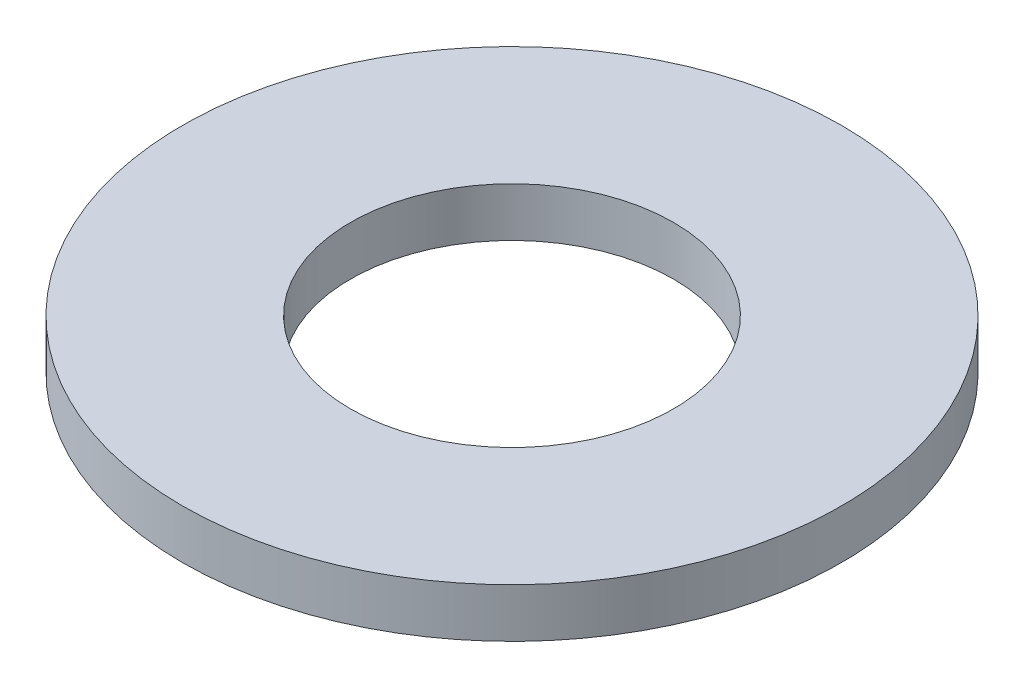
ISO-10303-21;
HEADER;
FILE_DESCRIPTION(('STEP AP214'),'2;1');
FILE_NAME('part.step','',(''),(''),'','','');
FILE_SCHEMA(('AUTOMOTIVE_DESIGN { 1 0 10303 214 1 1 1 1 }'));
ENDSEC;
DATA;
#1=APPLICATION_CONTEXT('core data for automotive mechanical design processes');
#2=APPLICATION_PROTOCOL_DEFINITION('international standard','automotive_design',2000,#1);
#3=PRODUCT_CONTEXT('',#1,'mechanical');
#4=PRODUCT('Part','Part','',(#3));
#5=PRODUCT_RELATED_PRODUCT_CATEGORY('part','',(#4));
#6=PRODUCT_DEFINITION_FORMATION('','',#4);
#7=PRODUCT_DEFINITION_CONTEXT('part definition',#1,'design');
#8=PRODUCT_DEFINITION('design','',#6,#7);
#9=PRODUCT_DEFINITION_SHAPE('','',#8);
#10=(LENGTH_UNIT() NAMED_UNIT(*) SI_UNIT(.MILLI.,.METRE.));
#11=(NAMED_UNIT(*) PLANE_ANGLE_UNIT() SI_UNIT($,.RADIAN.));
#12=(NAMED_UNIT(*) SI_UNIT($,.STERADIAN.) SOLID_ANGLE_UNIT());
#13=UNCERTAINTY_MEASURE_WITH_UNIT(LENGTH_MEASURE(1.E-05),#10,'distance_accuracy_value','');
#14=(GEOMETRIC_REPRESENTATION_CONTEXT(3) GLOBAL_UNCERTAINTY_ASSIGNED_CONTEXT((#13)) GLOBAL_UNIT_ASSIGNED_CONTEXT((#10,
#11,#12)) REPRESENTATION_CONTEXT('',''));
#15=CARTESIAN_POINT('',(0.,0.,0.));
#16=DIRECTION('',(0.,0.,1.));
#17=DIRECTION('',(1.,0.,0.));
#18=AXIS2_PLACEMENT_3D('',#15,#16,#17);
#19=CARTESIAN_POINT('',(0.,0.4826,0.));
#20=DIRECTION('',(0.,-1.,0.));
#21=DIRECTION('',(0.,0.,-1.));
#22=AXIS2_PLACEMENT_3D('',#19,#20,#21);
#23=CYLINDRICAL_SURFACE('',#22,3.2385);
#24=CARTESIAN_POINT('',(0.,0.4826,0.));
#25=DIRECTION('',(0.,1.,0.));
#26=DIRECTION('',(0.,0.,1.));
#27=AXIS2_PLACEMENT_3D('',#24,#25,#26);
#28=CIRCLE('',#27,3.2385);
#29=CARTESIAN_POINT('',(0.,0.4826,-3.2385));
#30=VERTEX_POINT('',#29);
#31=EDGE_CURVE('E10',#30,#30,#28,.T.);
#32=CARTESIAN_POINT('',(0.,0.,0.));
#33=DIRECTION('',(0.,1.,0.));
#34=DIRECTION('',(0.,0.,1.));
#35=AXIS2_PLACEMENT_3D('',#32,#33,#34);
#36=CIRCLE('',#35,3.2385);
#37=CARTESIAN_POINT('',(0.,0.,-3.2385));
#38=VERTEX_POINT('',#37);
#39=EDGE_CURVE('E31',#38,#38,#36,.T.);
#40=CARTESIAN_POINT('',(0.,0.4826,-3.2385));
#41=CARTESIAN_POINT('',(0.,0.477572916666667,-3.2385));
#42=CARTESIAN_POINT('',(0.,0.472545833333333,-3.2385));
#43=CARTESIAN_POINT('',(0.,0.462491666666667,-3.2385));
#44=CARTESIAN_POINT('',(0.,0.457464583333333,-3.2385));
#45=CARTESIAN_POINT('',(0.,0.447410416666667,-3.2385));
#46=CARTESIAN_POINT('',(0.,0.442383333333333,-3.2385));
#47=CARTESIAN_POINT('',(0.,0.432329166666667,-3.2385));
#48=CARTESIAN_POINT('',(0.,0.427302083333333,-3.2385));
#49=CARTESIAN_POINT('',(0.,0.417247916666667,-3.2385));
#50=CARTESIAN_POINT('',(0.,0.412220833333333,-3.2385));
#51=CARTESIAN_POINT('',(0.,0.402166666666667,-3.2385));
#52=CARTESIAN_POINT('',(0.,0.397139583333333,-3.2385));
#53=CARTESIAN_POINT('',(0.,0.387085416666667,-3.2385));
#54=CARTESIAN_POINT('',(0.,0.382058333333333,-3.2385));
#55=CARTESIAN_POINT('',(0.,0.372004166666667,-3.2385));
#56=CARTESIAN_POINT('',(0.,0.366977083333333,-3.2385));
#57=CARTESIAN_POINT('',(0.,0.356922916666667,-3.2385));
#58=CARTESIAN_POINT('',(0.,0.351895833333333,-3.2385));
#59=CARTESIAN_POINT('',(0.,0.341841666666667,-3.2385));
#60=CARTESIAN_POINT('',(0.,0.336814583333333,-3.2385));
#61=CARTESIAN_POINT('',(0.,0.326760416666667,-3.2385));
#62=CARTESIAN_POINT('',(0.,0.321733333333333,-3.2385));
#63=CARTESIAN_POINT('',(0.,0.311679166666667,-3.2385));
#64=CARTESIAN_POINT('',(0.,0.306652083333333,-3.2385));
#65=CARTESIAN_POINT('',(0.,0.296597916666667,-3.2385));
#66=CARTESIAN_POINT('',(0.,0.291570833333333,-3.2385));
#67=CARTESIAN_POINT('',(0.,0.281516666666667,-3.2385));
#68=CARTESIAN_POINT('',(0.,0.276489583333333,-3.2385));
#69=CARTESIAN_POINT('',(0.,0.266435416666667,-3.2385));
#70=CARTESIAN_POINT('',(0.,0.261408333333333,-3.2385));
#71=CARTESIAN_POINT('',(0.,0.251354166666667,-3.2385));
#72=CARTESIAN_POINT('',(0.,0.246327083333333,-3.2385));
#73=CARTESIAN_POINT('',(0.,0.236272916666667,-3.2385));
#74=CARTESIAN_POINT('',(0.,0.231245833333333,-3.2385));
#75=CARTESIAN_POINT('',(0.,0.221191666666667,-3.2385));
#76=CARTESIAN_POINT('',(0.,0.216164583333333,-3.2385));
#77=CARTESIAN_POINT('',(0.,0.206110416666667,-3.2385));
#78=CARTESIAN_POINT('',(0.,0.201083333333333,-3.2385));
#79=CARTESIAN_POINT('',(0.,0.191029166666667,-3.2385));
#80=CARTESIAN_POINT('',(0.,0.186002083333333,-3.2385));
#81=CARTESIAN_POINT('',(0.,0.175947916666667,-3.2385));
#82=CARTESIAN_POINT('',(0.,0.170920833333333,-3.2385));
#83=CARTESIAN_POINT('',(0.,0.160866666666667,-3.2385));
#84=CARTESIAN_POINT('',(0.,0.155839583333333,-3.2385));
#85=CARTESIAN_POINT('',(0.,0.145785416666667,-3.2385));
#86=CARTESIAN_POINT('',(0.,0.140758333333333,-3.2385));
#87=CARTESIAN_POINT('',(0.,0.130704166666667,-3.2385));
#88=CARTESIAN_POINT('',(0.,0.125677083333333,-3.2385));
#89=CARTESIAN_POINT('',(0.,0.115622916666667,-3.2385));
#90=CARTESIAN_POINT('',(0.,0.110595833333333,-3.2385));
#91=CARTESIAN_POINT('',(0.,0.100541666666667,-3.2385));
#92=CARTESIAN_POINT('',(0.,0.0955145833333333,-3.2385));
#93=CARTESIAN_POINT('',(0.,0.0854604166666667,-3.2385));
#94=CARTESIAN_POINT('',(0.,0.0804333333333333,-3.2385));
#95=CARTESIAN_POINT('',(0.,0.0703791666666667,-3.2385));
#96=CARTESIAN_POINT('',(0.,0.0653520833333334,-3.2385));
#97=CARTESIAN_POINT('',(0.,0.0552979166666667,-3.2385));
#98=CARTESIAN_POINT('',(0.,0.0502708333333333,-3.2385));
#99=CARTESIAN_POINT('',(0.,0.0402166666666666,-3.2385));
#100=CARTESIAN_POINT('',(0.,0.0351895833333333,-3.2385));
#101=CARTESIAN_POINT('',(0.,0.0251354166666666,-3.2385));
#102=CARTESIAN_POINT('',(0.,0.0201083333333333,-3.2385));
#103=CARTESIAN_POINT('',(0.,0.0100541666666667,-3.2385));
#104=CARTESIAN_POINT('',(0.,0.00502708333333333,-3.2385));
#105=CARTESIAN_POINT('',(0.,0.,-3.2385));
#106=B_SPLINE_CURVE_WITH_KNOTS('',3,(#40,#41,#42,#43,#44,#45,#46,#47,#48,#49,#50,#51,#52,#53,
#54,#55,#56,#57,#58,#59,#60,#61,#62,#63,#64,#65,#66,#67,#68,#69,#70,#71,#72,#73,#74,#75,#76,#77,
#78,#79,#80,#81,#82,#83,#84,#85,#86,#87,#88,#89,#90,#91,#92,#93,#94,#95,#96,#97,#98,#99,#100,
#101,#102,#103,#104,#105),.UNSPECIFIED.,.F.,.F.,(4,2,2,2,2,2,2,2,2,2,2,2,2,2,2,2,2,2,2,2,2,2,2,
2,2,2,2,2,2,2,2,2,4),(0.,0.01508125,0.0301625,0.04524375,0.060325,0.07540625,0.0904874999999999,
0.10556875,0.12065,0.13573125,0.1508125,0.16589375,0.180975,0.19605625,0.2111375,0.22621875,
0.2413,0.25638125,0.2714625,0.28654375,0.301625,0.31670625,0.3317875,0.34686875,0.36195,
0.37703125,0.3921125,0.40719375,0.422275,0.43735625,0.4524375,0.46751875,0.4826),.UNSPECIFIED.);
#107=EDGE_CURVE('BSEAM28',#30,#38,#106,.T.);
#108=ORIENTED_EDGE('',*,*,#31,.F.);
#109=ORIENTED_EDGE('',*,*,#39,.T.);
#110=ORIENTED_EDGE('',*,*,#107,.T.);
#111=ORIENTED_EDGE('',*,*,#107,.F.);
#112=EDGE_LOOP('',(#108,#110,#109,#111));
#113=FACE_BOUND('',#112,.T.);
#114=ADVANCED_FACE('F28',(#113),#23,.T.);
#115=CARTESIAN_POINT('',(0.,0.4826,0.));
#116=DIRECTION('',(0.,1.,0.));
#117=DIRECTION('',(0.,0.,1.));
#118=AXIS2_PLACEMENT_3D('',#115,#116,#117);
#119=PLANE('',#118);
#120=CARTESIAN_POINT('',(0.,0.4826,0.));
#121=DIRECTION('',(0.,1.,0.));
#122=DIRECTION('',(0.,0.,1.));
#123=AXIS2_PLACEMENT_3D('',#120,#121,#122);
#124=CIRCLE('',#123,1.5875);
#125=CARTESIAN_POINT('',(0.,0.4826,1.5875));
#126=VERTEX_POINT('',#125);
#127=EDGE_CURVE('E40',#126,#126,#124,.T.);
#128=ORIENTED_EDGE('',*,*,#127,.F.);
#129=EDGE_LOOP('',(#128));
#130=FACE_BOUND('',#129,.T.);
#131=ORIENTED_EDGE('',*,*,#31,.T.);
#132=EDGE_LOOP('',(#131));
#133=FACE_BOUND('',#132,.T.);
#134=ADVANCED_FACE('F55',(#130,#133),#119,.T.);
#135=CARTESIAN_POINT('',(0.,0.,0.));
#136=DIRECTION('',(0.,1.,0.));
#137=DIRECTION('',(0.,0.,1.));
#138=AXIS2_PLACEMENT_3D('',#135,#136,#137);
#139=PLANE('',#138);
#140=CARTESIAN_POINT('',(0.,0.,0.));
#141=DIRECTION('',(0.,1.,0.));
#142=DIRECTION('',(0.,0.,1.));
#143=AXIS2_PLACEMENT_3D('',#140,#141,#142);
#144=CIRCLE('',#143,1.5875);
#145=CARTESIAN_POINT('',(0.,0.,1.5875));
#146=VERTEX_POINT('',#145);
#147=EDGE_CURVE('E38',#146,#146,#144,.T.);
#148=ORIENTED_EDGE('',*,*,#147,.T.);
#149=EDGE_LOOP('',(#148));
#150=FACE_BOUND('',#149,.T.);
#151=ORIENTED_EDGE('',*,*,#39,.F.);
#152=EDGE_LOOP('',(#151));
#153=FACE_BOUND('',#152,.T.);
#154=ADVANCED_FACE('F46',(#150,#153),#139,.F.);
#155=CARTESIAN_POINT('',(0.,0.,0.));
#156=DIRECTION('',(0.,1.,0.));
#157=DIRECTION('',(0.,0.,1.));
#158=AXIS2_PLACEMENT_3D('',#155,#156,#157);
#159=CYLINDRICAL_SURFACE('',#158,1.5875);
#160=CARTESIAN_POINT('',(0.,0.,1.5875));
#161=CARTESIAN_POINT('',(0.,0.00502708333333333,1.5875));
#162=CARTESIAN_POINT('',(0.,0.0100541666666667,1.5875));
#163=CARTESIAN_POINT('',(0.,0.0201083333333333,1.5875));
#164=CARTESIAN_POINT('',(0.,0.0251354166666667,1.5875));
#165=CARTESIAN_POINT('',(0.,0.0351895833333333,1.5875));
#166=CARTESIAN_POINT('',(0.,0.0402166666666667,1.5875));
#167=CARTESIAN_POINT('',(0.,0.0502708333333333,1.5875));
#168=CARTESIAN_POINT('',(0.,0.0552979166666667,1.5875));
#169=CARTESIAN_POINT('',(0.,0.0653520833333333,1.5875));
#170=CARTESIAN_POINT('',(0.,0.0703791666666667,1.5875));
#171=CARTESIAN_POINT('',(0.,0.0804333333333333,1.5875));
#172=CARTESIAN_POINT('',(0.,0.0854604166666666,1.5875));
#173=CARTESIAN_POINT('',(0.,0.0955145833333333,1.5875));
#174=CARTESIAN_POINT('',(0.,0.100541666666667,1.5875));
#175=CARTESIAN_POINT('',(0.,0.110595833333333,1.5875));
#176=CARTESIAN_POINT('',(0.,0.115622916666667,1.5875));
#177=CARTESIAN_POINT('',(0.,0.125677083333333,1.5875));
#178=CARTESIAN_POINT('',(0.,0.130704166666667,1.5875));
#179=CARTESIAN_POINT('',(0.,0.140758333333333,1.5875));
#180=CARTESIAN_POINT('',(0.,0.145785416666667,1.5875));
#181=CARTESIAN_POINT('',(0.,0.155839583333333,1.5875));
#182=CARTESIAN_POINT('',(0.,0.160866666666667,1.5875));
#183=CARTESIAN_POINT('',(0.,0.170920833333333,1.5875));
#184=CARTESIAN_POINT('',(0.,0.175947916666667,1.5875));
#185=CARTESIAN_POINT('',(0.,0.186002083333333,1.5875));
#186=CARTESIAN_POINT('',(0.,0.191029166666667,1.5875));
#187=CARTESIAN_POINT('',(0.,0.201083333333333,1.5875));
#188=CARTESIAN_POINT('',(0.,0.206110416666667,1.5875));
#189=CARTESIAN_POINT('',(0.,0.216164583333333,1.5875));
#190=CARTESIAN_POINT('',(0.,0.221191666666667,1.5875));
#191=CARTESIAN_POINT('',(0.,0.231245833333333,1.5875));
#192=CARTESIAN_POINT('',(0.,0.236272916666667,1.5875));
#193=CARTESIAN_POINT('',(0.,0.246327083333333,1.5875));
#194=CARTESIAN_POINT('',(0.,0.251354166666667,1.5875));
#195=CARTESIAN_POINT('',(0.,0.261408333333333,1.5875));
#196=CARTESIAN_POINT('',(0.,0.266435416666667,1.5875));
#197=CARTESIAN_POINT('',(0.,0.276489583333333,1.5875));
#198=CARTESIAN_POINT('',(0.,0.281516666666667,1.5875));
#199=CARTESIAN_POINT('',(0.,0.291570833333333,1.5875));
#200=CARTESIAN_POINT('',(0.,0.296597916666667,1.5875));
#201=CARTESIAN_POINT('',(0.,0.306652083333333,1.5875));
#202=CARTESIAN_POINT('',(0.,0.311679166666667,1.5875));
#203=CARTESIAN_POINT('',(0.,0.321733333333333,1.5875));
#204=CARTESIAN_POINT('',(0.,0.326760416666667,1.5875));
#205=CARTESIAN_POINT('',(0.,0.336814583333333,1.5875));
#206=CARTESIAN_POINT('',(0.,0.341841666666667,1.5875));
#207=CARTESIAN_POINT('',(0.,0.351895833333333,1.5875));
#208=CARTESIAN_POINT('',(0.,0.356922916666667,1.5875));
#209=CARTESIAN_POINT('',(0.,0.366977083333333,1.5875));
#210=CARTESIAN_POINT('',(0.,0.372004166666667,1.5875));
#211=CARTESIAN_POINT('',(0.,0.382058333333333,1.5875));
#212=CARTESIAN_POINT('',(0.,0.387085416666667,1.5875));
#213=CARTESIAN_POINT('',(0.,0.397139583333333,1.5875));
#214=CARTESIAN_POINT('',(0.,0.402166666666667,1.5875));
#215=CARTESIAN_POINT('',(0.,0.412220833333333,1.5875));
#216=CARTESIAN_POINT('',(0.,0.417247916666667,1.5875));
#217=CARTESIAN_POINT('',(0.,0.427302083333333,1.5875));
#218=CARTESIAN_POINT('',(0.,0.432329166666667,1.5875));
#219=CARTESIAN_POINT('',(0.,0.442383333333333,1.5875));
#220=CARTESIAN_POINT('',(0.,0.447410416666667,1.5875));
#221=CARTESIAN_POINT('',(0.,0.457464583333333,1.5875));
#222=CARTESIAN_POINT('',(0.,0.462491666666667,1.5875));
#223=CARTESIAN_POINT('',(0.,0.472545833333333,1.5875));
#224=CARTESIAN_POINT('',(0.,0.477572916666667,1.5875));
#225=CARTESIAN_POINT('',(0.,0.4826,1.5875));
#226=B_SPLINE_CURVE_WITH_KNOTS('',3,(#160,#161,#162,#163,#164,#165,#166,#167,#168,#169,#170,
#171,#172,#173,#174,#175,#176,#177,#178,#179,#180,#181,#182,#183,#184,#185,#186,#187,#188,#189,
#190,#191,#192,#193,#194,#195,#196,#197,#198,#199,#200,#201,#202,#203,#204,#205,#206,#207,#208,
#209,#210,#211,#212,#213,#214,#215,#216,#217,#218,#219,#220,#221,#222,#223,#224,#225),
.UNSPECIFIED.,.F.,.F.,(4,2,2,2,2,2,2,2,2,2,2,2,2,2,2,2,2,2,2,2,2,2,2,2,2,2,2,2,2,2,2,2,4),(0.,
0.01508125,0.0301625,0.04524375,0.060325,0.07540625,0.0904875,0.10556875,0.12065,0.13573125,
0.1508125,0.16589375,0.180975,0.19605625,0.2111375,0.22621875,0.2413,0.25638125,0.2714625,
0.28654375,0.301625,0.31670625,0.3317875,0.34686875,0.36195,0.37703125,0.3921125,0.40719375,
0.422275,0.43735625,0.4524375,0.46751875,0.4826),.UNSPECIFIED.);
#227=EDGE_CURVE('BSEAM49',#146,#126,#226,.T.);
#228=ORIENTED_EDGE('',*,*,#147,.F.);
#229=ORIENTED_EDGE('',*,*,#127,.T.);
#230=ORIENTED_EDGE('',*,*,#227,.T.);
#231=ORIENTED_EDGE('',*,*,#227,.F.);
#232=EDGE_LOOP('',(#228,#230,#229,#231));
#233=FACE_BOUND('',#232,.T.);
#234=ADVANCED_FACE('F49',(#233),#159,.F.);
#235=CLOSED_SHELL('',(#114,#134,#154,#234));
#236=MANIFOLD_SOLID_BREP('B2',#235);
#237=ADVANCED_BREP_SHAPE_REPRESENTATION('',(#18,#236),#14);
#238=SHAPE_DEFINITION_REPRESENTATION(#9,#237);
ENDSEC;
END-ISO-10303-21;
